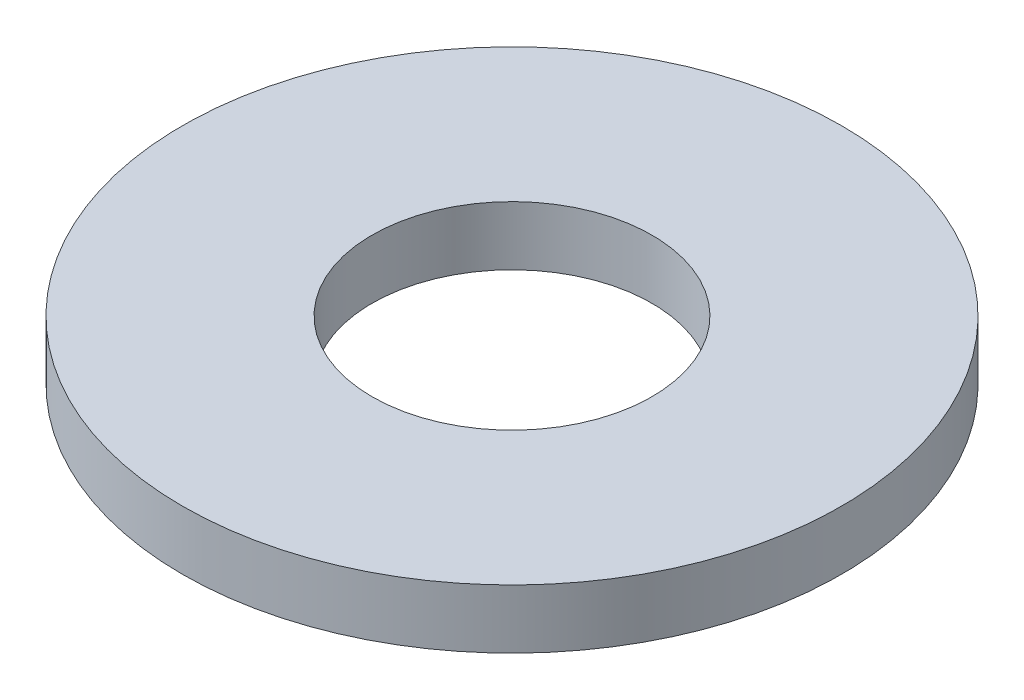
ISO-10303-21;
HEADER;
FILE_DESCRIPTION(('STEP AP214'),'2;1');
FILE_NAME('part.step','',(''),(''),'','','');
FILE_SCHEMA(('AUTOMOTIVE_DESIGN { 1 0 10303 214 1 1 1 1 }'));
ENDSEC;
DATA;
#1=APPLICATION_CONTEXT('core data for automotive mechanical design processes');
#2=APPLICATION_PROTOCOL_DEFINITION('international standard','automotive_design',2000,#1);
#3=PRODUCT_CONTEXT('',#1,'mechanical');
#4=PRODUCT('Part','Part','',(#3));
#5=PRODUCT_RELATED_PRODUCT_CATEGORY('part','',(#4));
#6=PRODUCT_DEFINITION_FORMATION('','',#4);
#7=PRODUCT_DEFINITION_CONTEXT('part definition',#1,'design');
#8=PRODUCT_DEFINITION('design','',#6,#7);
#9=PRODUCT_DEFINITION_SHAPE('','',#8);
#10=(LENGTH_UNIT() NAMED_UNIT(*) SI_UNIT(.MILLI.,.METRE.));
#11=(NAMED_UNIT(*) PLANE_ANGLE_UNIT() SI_UNIT($,.RADIAN.));
#12=(NAMED_UNIT(*) SI_UNIT($,.STERADIAN.) SOLID_ANGLE_UNIT());
#13=UNCERTAINTY_MEASURE_WITH_UNIT(LENGTH_MEASURE(1.E-05),#10,'distance_accuracy_value','');
#14=(GEOMETRIC_REPRESENTATION_CONTEXT(3) GLOBAL_UNCERTAINTY_ASSIGNED_CONTEXT((#13)) GLOBAL_UNIT_ASSIGNED_CONTEXT((#10,
#11,#12)) REPRESENTATION_CONTEXT('',''));
#15=CARTESIAN_POINT('',(0.,0.,0.));
#16=DIRECTION('',(0.,0.,1.));
#17=DIRECTION('',(1.,0.,0.));
#18=AXIS2_PLACEMENT_3D('',#15,#16,#17);
#19=CARTESIAN_POINT('',(0.,2.8448,0.));
#20=DIRECTION('',(0.,1.,0.));
#21=DIRECTION('',(0.,0.,1.));
#22=AXIS2_PLACEMENT_3D('',#19,#20,#21);
#23=PLANE('',#22);
#24=CARTESIAN_POINT('',(0.,2.8448,0.));
#25=DIRECTION('',(0.,1.,0.));
#26=DIRECTION('',(0.,0.,1.));
#27=AXIS2_PLACEMENT_3D('',#24,#25,#26);
#28=CIRCLE('',#27,15.875);
#29=CARTESIAN_POINT('',(0.,2.8448,15.875));
#30=VERTEX_POINT('',#29);
#31=EDGE_CURVE('E10',#30,#30,#28,.T.);
#32=ORIENTED_EDGE('',*,*,#31,.T.);
#33=EDGE_LOOP('',(#32));
#34=FACE_BOUND('',#33,.T.);
#35=CARTESIAN_POINT('',(0.,2.8448,0.));
#36=DIRECTION('',(0.,1.,0.));
#37=DIRECTION('',(0.,0.,1.));
#38=AXIS2_PLACEMENT_3D('',#35,#36,#37);
#39=CIRCLE('',#38,6.7437);
#40=CARTESIAN_POINT('',(0.,2.8448,6.7437));
#41=VERTEX_POINT('',#40);
#42=EDGE_CURVE('E47',#41,#41,#39,.T.);
#43=ORIENTED_EDGE('',*,*,#42,.F.);
#44=EDGE_LOOP('',(#43));
#45=FACE_BOUND('',#44,.T.);
#46=ADVANCED_FACE('F36',(#34,#45),#23,.T.);
#47=CARTESIAN_POINT('',(0.,0.,0.));
#48=DIRECTION('',(0.,1.,0.));
#49=DIRECTION('',(0.,0.,1.));
#50=AXIS2_PLACEMENT_3D('',#47,#48,#49);
#51=PLANE('',#50);
#52=CARTESIAN_POINT('',(0.,0.,0.));
#53=DIRECTION('',(0.,1.,0.));
#54=DIRECTION('',(0.,0.,1.));
#55=AXIS2_PLACEMENT_3D('',#52,#53,#54);
#56=CIRCLE('',#55,15.875);
#57=CARTESIAN_POINT('',(0.,0.,15.875));
#58=VERTEX_POINT('',#57);
#59=EDGE_CURVE('E43',#58,#58,#56,.T.);
#60=ORIENTED_EDGE('',*,*,#59,.F.);
#61=EDGE_LOOP('',(#60));
#62=FACE_BOUND('',#61,.T.);
#63=CARTESIAN_POINT('',(0.,0.,0.));
#64=DIRECTION('',(0.,1.,0.));
#65=DIRECTION('',(0.,0.,1.));
#66=AXIS2_PLACEMENT_3D('',#63,#64,#65);
#67=CIRCLE('',#66,6.7437);
#68=CARTESIAN_POINT('',(0.,0.,6.7437));
#69=VERTEX_POINT('',#68);
#70=EDGE_CURVE('E51',#69,#69,#67,.T.);
#71=ORIENTED_EDGE('',*,*,#70,.T.);
#72=EDGE_LOOP('',(#71));
#73=FACE_BOUND('',#72,.T.);
#74=ADVANCED_FACE('F57',(#62,#73),#51,.F.);
#75=CARTESIAN_POINT('',(0.,2.8448,0.));
#76=DIRECTION('',(0.,-1.,0.));
#77=DIRECTION('',(0.,0.,-1.));
#78=AXIS2_PLACEMENT_3D('',#75,#76,#77);
#79=CYLINDRICAL_SURFACE('',#78,15.875);
#80=ORIENTED_EDGE('',*,*,#31,.F.);
#81=EDGE_LOOP('',(#80));
#82=FACE_BOUND('',#81,.T.);
#83=ORIENTED_EDGE('',*,*,#59,.T.);
#84=EDGE_LOOP('',(#83));
#85=FACE_BOUND('',#84,.T.);
#86=ADVANCED_FACE('F38',(#82,#85),#79,.T.);
#87=CARTESIAN_POINT('',(0.,2.8448,0.));
#88=DIRECTION('',(0.,-1.,0.));
#89=DIRECTION('',(0.,0.,-1.));
#90=AXIS2_PLACEMENT_3D('',#87,#88,#89);
#91=CYLINDRICAL_SURFACE('',#90,6.7437);
#92=ORIENTED_EDGE('',*,*,#42,.T.);
#93=EDGE_LOOP('',(#92));
#94=FACE_BOUND('',#93,.T.);
#95=ORIENTED_EDGE('',*,*,#70,.F.);
#96=EDGE_LOOP('',(#95));
#97=FACE_BOUND('',#96,.T.);
#98=ADVANCED_FACE('F59',(#94,#97),#91,.F.);
#99=CLOSED_SHELL('',(#46,#74,#86,#98));
#100=MANIFOLD_SOLID_BREP('B2',#99);
#101=ADVANCED_BREP_SHAPE_REPRESENTATION('',(#18,#100),#14);
#102=SHAPE_DEFINITION_REPRESENTATION(#9,#101);
ENDSEC;
END-ISO-10303-21;
